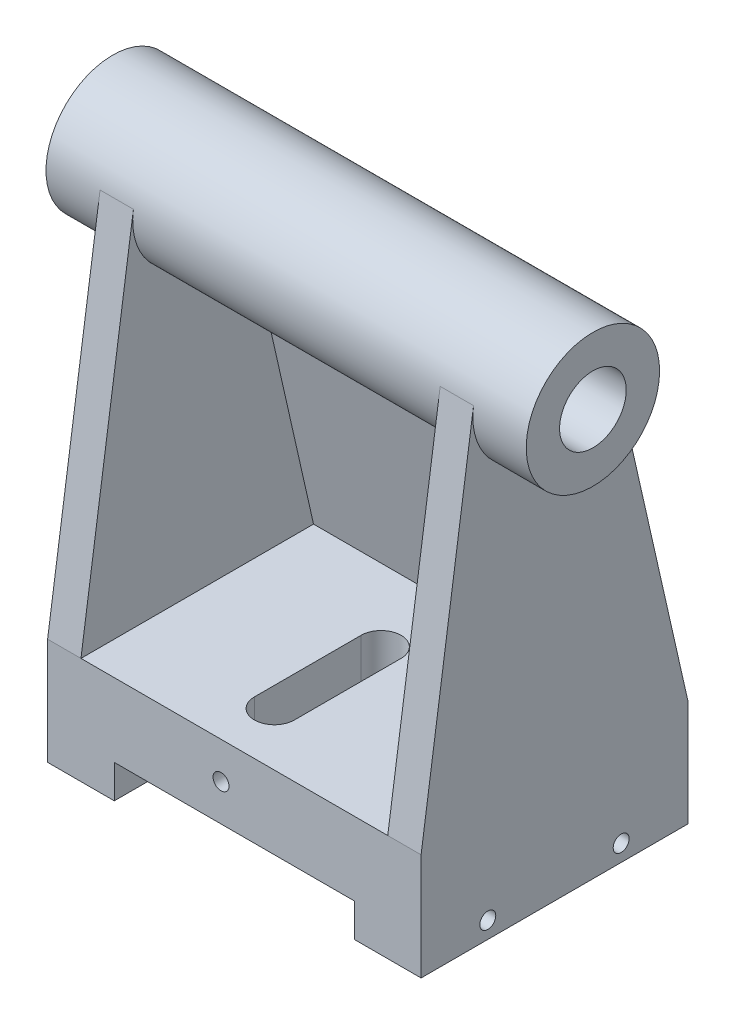
ISO-10303-21;
HEADER;
FILE_DESCRIPTION(('STEP AP214'),'2;1');
FILE_NAME('part.step','',(''),(''),'','','');
FILE_SCHEMA(('AUTOMOTIVE_DESIGN { 1 0 10303 214 1 1 1 1 }'));
ENDSEC;
DATA;
#1=APPLICATION_CONTEXT('core data for automotive mechanical design processes');
#2=APPLICATION_PROTOCOL_DEFINITION('international standard','automotive_design',2000,#1);
#3=PRODUCT_CONTEXT('',#1,'mechanical');
#4=PRODUCT('Part','Part','',(#3));
#5=PRODUCT_RELATED_PRODUCT_CATEGORY('part','',(#4));
#6=PRODUCT_DEFINITION_FORMATION('','',#4);
#7=PRODUCT_DEFINITION_CONTEXT('part definition',#1,'design');
#8=PRODUCT_DEFINITION('design','',#6,#7);
#9=PRODUCT_DEFINITION_SHAPE('','',#8);
#10=(LENGTH_UNIT() NAMED_UNIT(*) SI_UNIT(.MILLI.,.METRE.));
#11=(NAMED_UNIT(*) PLANE_ANGLE_UNIT() SI_UNIT($,.RADIAN.));
#12=(NAMED_UNIT(*) SI_UNIT($,.STERADIAN.) SOLID_ANGLE_UNIT());
#13=UNCERTAINTY_MEASURE_WITH_UNIT(LENGTH_MEASURE(1.E-05),#10,'distance_accuracy_value','');
#14=(GEOMETRIC_REPRESENTATION_CONTEXT(3) GLOBAL_UNCERTAINTY_ASSIGNED_CONTEXT((#13)) GLOBAL_UNIT_ASSIGNED_CONTEXT((#10,
#11,#12)) REPRESENTATION_CONTEXT('',''));
#15=CARTESIAN_POINT('',(0.,0.,0.));
#16=DIRECTION('',(0.,0.,1.));
#17=DIRECTION('',(1.,0.,0.));
#18=AXIS2_PLACEMENT_3D('',#15,#16,#17);
#19=CARTESIAN_POINT('',(0.,5.70278302507328,-25.1954791552857));
#20=DIRECTION('',(0.,0.220757391263944,-0.975328751858745));
#21=DIRECTION('',(0.,0.975328751858745,0.220757391263944));
#22=AXIS2_PLACEMENT_3D('',#19,#20,#21);
#23=PLANE('',#22);
#24=DIRECTION('',(-1.,0.,0.));
#25=VECTOR('',#24,1.);
#26=CARTESIAN_POINT('',(57.15,85.1172926092598,-7.22067842178947));
#27=LINE('',#26,#25);
#28=CARTESIAN_POINT('',(-36.5125,85.1172926092598,-7.22067842178947));
#29=VERTEX_POINT('',#28);
#30=CARTESIAN_POINT('',(36.5125,85.1172926092598,-7.22067842178947));
#31=VERTEX_POINT('',#30);
#32=EDGE_CURVE('E11',#29,#31,#27,.F.);
#33=ORIENTED_EDGE('',*,*,#32,.F.);
#34=DIRECTION('',(0.,0.975328751858745,0.220757391263944));
#35=VECTOR('',#34,1.);
#36=CARTESIAN_POINT('',(-36.5125,98.5262617931576,-4.18567196787884));
#37=LINE('',#36,#35);
#38=CARTESIAN_POINT('',(-36.5125,12.7,-23.6117184360935));
#39=VERTEX_POINT('',#38);
#40=EDGE_CURVE('E45',#39,#29,#37,.T.);
#41=ORIENTED_EDGE('',*,*,#40,.F.);
#42=DIRECTION('',(-1.,0.,0.));
#43=VECTOR('',#42,1.);
#44=CARTESIAN_POINT('',(0.,12.7,-23.6117184360935));
#45=LINE('',#44,#43);
#46=CARTESIAN_POINT('',(36.5125,12.7,-23.6117184360935));
#47=VERTEX_POINT('',#46);
#48=EDGE_CURVE('E59',#47,#39,#45,.T.);
#49=ORIENTED_EDGE('',*,*,#48,.F.);
#50=DIRECTION('',(0.,-0.975328751858745,-0.220757391263944));
#51=VECTOR('',#50,1.);
#52=CARTESIAN_POINT('',(36.5125,10.9477382068425,-24.0083280321212));
#53=LINE('',#52,#51);
#54=EDGE_CURVE('E52',#31,#47,#53,.T.);
#55=ORIENTED_EDGE('',*,*,#54,.F.);
#56=EDGE_LOOP('',(#33,#41,#49,#55));
#57=FACE_BOUND('',#56,.T.);
#58=ADVANCED_FACE('F37',(#57),#23,.F.);
#59=CARTESIAN_POINT('',(0.,12.7,0.));
#60=DIRECTION('',(0.,1.,0.));
#61=DIRECTION('',(0.,0.,1.));
#62=AXIS2_PLACEMENT_3D('',#59,#60,#61);
#63=PLANE('',#62);
#64=CARTESIAN_POINT('',(-3.175,12.7,19.05));
#65=DIRECTION('',(0.,1.,0.));
#66=DIRECTION('',(0.,0.,1.));
#67=AXIS2_PLACEMENT_3D('',#64,#65,#66);
#68=CIRCLE('',#67,4.7625);
#69=CARTESIAN_POINT('',(-7.9375,12.7,19.05));
#70=VERTEX_POINT('',#69);
#71=CARTESIAN_POINT('',(1.5875,12.7,19.05));
#72=VERTEX_POINT('',#71);
#73=EDGE_CURVE('E216',#70,#72,#68,.T.);
#74=ORIENTED_EDGE('',*,*,#73,.F.);
#75=DIRECTION('',(0.,0.,1.));
#76=VECTOR('',#75,1.);
#77=CARTESIAN_POINT('',(-7.9375,12.7,19.05));
#78=LINE('',#77,#76);
#79=CARTESIAN_POINT('',(-7.93749999999999,12.7,-6.34999999999998));
#80=VERTEX_POINT('',#79);
#81=EDGE_CURVE('E227',#80,#70,#78,.T.);
#82=ORIENTED_EDGE('',*,*,#81,.F.);
#83=CARTESIAN_POINT('',(-3.175,12.7,-6.34999999999998));
#84=DIRECTION('',(0.,1.,0.));
#85=DIRECTION('',(0.,0.,1.));
#86=AXIS2_PLACEMENT_3D('',#83,#84,#85);
#87=CIRCLE('',#86,4.76249999999999);
#88=CARTESIAN_POINT('',(1.5875,12.7,-6.34999999999998));
#89=VERTEX_POINT('',#88);
#90=EDGE_CURVE('E224',#89,#80,#87,.T.);
#91=ORIENTED_EDGE('',*,*,#90,.F.);
#92=DIRECTION('',(0.,0.,-1.));
#93=VECTOR('',#92,1.);
#94=CARTESIAN_POINT('',(1.5875,12.7,19.05));
#95=LINE('',#94,#93);
#96=EDGE_CURVE('E221',#72,#89,#95,.T.);
#97=ORIENTED_EDGE('',*,*,#96,.F.);
#98=EDGE_LOOP('',(#74,#82,#91,#97));
#99=FACE_BOUND('',#98,.T.);
#100=DIRECTION('',(0.,0.,-1.));
#101=VECTOR('',#100,1.);
#102=CARTESIAN_POINT('',(36.5125,12.7,31.75));
#103=LINE('',#102,#101);
#104=CARTESIAN_POINT('',(36.5125,12.7,31.75));
#105=VERTEX_POINT('',#104);
#106=EDGE_CURVE('E174',#105,#47,#103,.T.);
#107=ORIENTED_EDGE('',*,*,#106,.T.);
#108=ORIENTED_EDGE('',*,*,#48,.T.);
#109=DIRECTION('',(0.,0.,-1.));
#110=VECTOR('',#109,1.);
#111=CARTESIAN_POINT('',(-36.5125,12.7,31.75));
#112=LINE('',#111,#110);
#113=CARTESIAN_POINT('',(-36.5125,12.7,31.75));
#114=VERTEX_POINT('',#113);
#115=EDGE_CURVE('E186',#114,#39,#112,.T.);
#116=ORIENTED_EDGE('',*,*,#115,.F.);
#117=DIRECTION('',(1.,0.,0.));
#118=VECTOR('',#117,1.);
#119=CARTESIAN_POINT('',(44.45,12.7,31.75));
#120=LINE('',#119,#118);
#121=EDGE_CURVE('E284',#114,#105,#120,.T.);
#122=ORIENTED_EDGE('',*,*,#121,.T.);
#123=EDGE_LOOP('',(#107,#108,#116,#122));
#124=FACE_BOUND('',#123,.T.);
#125=ADVANCED_FACE('F347',(#99,#124),#63,.T.);
#126=CARTESIAN_POINT('',(36.5125,96.774,3.556));
#127=DIRECTION('',(-1.,0.,0.));
#128=DIRECTION('',(0.,0.,1.));
#129=AXIS2_PLACEMENT_3D('',#126,#127,#128);
#130=PLANE('',#129);
#131=CARTESIAN_POINT('',(36.5125,96.774,3.556));
#132=DIRECTION('',(-1.,0.,0.));
#133=DIRECTION('',(0.,0.,1.));
#134=AXIS2_PLACEMENT_3D('',#131,#132,#133);
#135=CIRCLE('',#134,15.875);
#136=CARTESIAN_POINT('',(36.5125,99.0453243279636,19.2676743473508));
#137=VERTEX_POINT('',#136);
#138=EDGE_CURVE('E167',#31,#137,#135,.T.);
#139=ORIENTED_EDGE('',*,*,#138,.F.);
#140=ORIENTED_EDGE('',*,*,#54,.T.);
#141=ORIENTED_EDGE('',*,*,#106,.F.);
#142=DIRECTION('',(0.,-0.989711769911861,0.143075548218177));
#143=VECTOR('',#142,1.);
#144=CARTESIAN_POINT('',(36.5125,12.7,31.75));
#145=LINE('',#144,#143);
#146=EDGE_CURVE('E170',#137,#105,#145,.T.);
#147=ORIENTED_EDGE('',*,*,#146,.F.);
#148=EDGE_LOOP('',(#139,#140,#141,#147));
#149=FACE_BOUND('',#148,.T.);
#150=ADVANCED_FACE('F168',(#149),#130,.T.);
#151=CARTESIAN_POINT('',(-36.5125,96.774,3.556));
#152=DIRECTION('',(1.,0.,0.));
#153=DIRECTION('',(0.,0.,-1.));
#154=AXIS2_PLACEMENT_3D('',#151,#152,#153);
#155=PLANE('',#154);
#156=ORIENTED_EDGE('',*,*,#115,.T.);
#157=ORIENTED_EDGE('',*,*,#40,.T.);
#158=CARTESIAN_POINT('',(-36.5125,96.774,3.556));
#159=DIRECTION('',(1.,0.,0.));
#160=DIRECTION('',(0.,0.,-1.));
#161=AXIS2_PLACEMENT_3D('',#158,#159,#160);
#162=CIRCLE('',#161,15.875);
#163=CARTESIAN_POINT('',(-36.5125,99.0453243279636,19.2676743473508));
#164=VERTEX_POINT('',#163);
#165=EDGE_CURVE('E181',#164,#29,#162,.T.);
#166=ORIENTED_EDGE('',*,*,#165,.F.);
#167=DIRECTION('',(0.,-0.989711769911861,0.143075548218177));
#168=VECTOR('',#167,1.);
#169=CARTESIAN_POINT('',(-36.5125,12.7,31.75));
#170=LINE('',#169,#168);
#171=EDGE_CURVE('E189',#164,#114,#170,.T.);
#172=ORIENTED_EDGE('',*,*,#171,.T.);
#173=EDGE_LOOP('',(#156,#157,#166,#172));
#174=FACE_BOUND('',#173,.T.);
#175=ADVANCED_FACE('F357',(#174),#155,.T.);
#176=CARTESIAN_POINT('',(-3.175,3.96875,31.75));
#177=DIRECTION('',(0.,0.,1.));
#178=DIRECTION('',(1.,0.,0.));
#179=AXIS2_PLACEMENT_3D('',#176,#177,#178);
#180=CYLINDRICAL_SURFACE('',#179,1.89864999999999);
#181=CARTESIAN_POINT('',(-1.27635000000001,3.96875,23.4176692213926));
#182=CARTESIAN_POINT('',(-1.27636109537331,3.86700854889232,23.4176794163693));
#183=CARTESIAN_POINT('',(-1.28457643204734,3.76512142960715,23.4212743372267));
#184=CARTESIAN_POINT('',(-1.31713207621968,3.56426805016252,23.4352053083698));
#185=CARTESIAN_POINT('',(-1.34151375473095,3.4653099661598,23.4455586529676));
#186=CARTESIAN_POINT('',(-1.40532467651031,3.27355991178216,23.4716320443976));
#187=CARTESIAN_POINT('',(-1.44469746407244,3.18074632249306,23.4873319332927));
#188=CARTESIAN_POINT('',(-1.53720817607736,3.00306394743353,23.5223013586832));
#189=CARTESIAN_POINT('',(-1.59034302696615,2.9181933934575,23.5415700978551));
#190=CARTESIAN_POINT('',(-1.71209910404013,2.75393589327512,23.5827318460628));
#191=CARTESIAN_POINT('',(-1.78137703205274,2.67505656503448,23.6047089046179));
#192=CARTESIAN_POINT('',(-1.93207009057371,2.52966532147243,23.6481165564904));
#193=CARTESIAN_POINT('',(-2.01348943011268,2.46315771306291,23.6695469572703));
#194=CARTESIAN_POINT('',(-2.19006994773536,2.34188378240749,23.7104545896829));
#195=CARTESIAN_POINT('',(-2.28564415517688,2.28767867738791,23.7298225918301));
#196=CARTESIAN_POINT('',(-2.48546477666903,2.19633174027643,23.7634051821786));
#197=CARTESIAN_POINT('',(-2.5897076638692,2.15918300853089,23.7776218537076));
#198=CARTESIAN_POINT('',(-2.79858456681381,2.10481269799039,23.7987049677712));
#199=CARTESIAN_POINT('',(-2.90295831724876,2.08671813989772,23.8058922221296));
#200=CARTESIAN_POINT('',(-3.1134916220198,2.06815953503027,23.8132657957007));
#201=CARTESIAN_POINT('',(-3.21965050031917,2.06768895798279,23.8134547080323));
#202=CARTESIAN_POINT('',(-3.42443326804291,2.08391144350377,23.8070060155598));
#203=CARTESIAN_POINT('',(-3.52314705898785,2.09964819920741,23.8007487585062));
#204=CARTESIAN_POINT('',(-3.71639796172513,2.14621301204534,23.7826227230789));
#205=CARTESIAN_POINT('',(-3.8109347666598,2.17704217592371,23.7707535331777));
#206=CARTESIAN_POINT('',(-3.99484859828555,2.25329594874747,23.7423395811026));
#207=CARTESIAN_POINT('',(-4.08412655183177,2.298933245921,23.7257271369143));
#208=CARTESIAN_POINT('',(-4.25398702067136,2.40330915718809,23.6894770707807));
#209=CARTESIAN_POINT('',(-4.33456655014057,2.4620522488957,23.669838415637));
#210=CARTESIAN_POINT('',(-4.49032614462156,2.59544163092466,23.6280177191903));
#211=CARTESIAN_POINT('',(-4.56481050410694,2.67087566716468,23.6057533351387));
#212=CARTESIAN_POINT('',(-4.70035563127269,2.83325348241173,23.5621809066277));
#213=CARTESIAN_POINT('',(-4.76141206436108,2.92020096353975,23.5408731727402));
#214=CARTESIAN_POINT('',(-4.86994479180545,3.10622790762721,23.5010687480331));
#215=CARTESIAN_POINT('',(-4.91699471381561,3.20557815474876,23.4826670619403));
#216=CARTESIAN_POINT('',(-4.9934204103413,3.41172055153924,23.4518713592928));
#217=CARTESIAN_POINT('',(-5.02280757346598,3.51850785625665,23.4394734726074));
#218=CARTESIAN_POINT('',(-5.06138720629323,3.72955634664625,23.4230270618592));
#219=CARTESIAN_POINT('',(-5.07169859499818,3.8335765451844,23.4185168442205));
#220=CARTESIAN_POINT('',(-5.07509542813421,4.04193603263268,23.4170415319272));
#221=CARTESIAN_POINT('',(-5.06818604211773,4.14627521639412,23.4200741729602));
#222=CARTESIAN_POINT('',(-5.03835600957465,4.34612314328988,23.432869307112));
#223=CARTESIAN_POINT('',(-5.01636065421577,4.44179797588751,23.4422424729454));
#224=CARTESIAN_POINT('',(-4.95818144187578,4.6280367298851,23.4661807458619));
#225=CARTESIAN_POINT('',(-4.92199445198079,4.71859951770804,23.4807469992951));
#226=CARTESIAN_POINT('',(-4.83482629725628,4.8961229564048,23.5141504173575));
#227=CARTESIAN_POINT('',(-4.7833065099966,4.98279026732356,23.5331363525304));
#228=CARTESIAN_POINT('',(-4.66748704685098,5.14664189723617,23.5730117871511));
#229=CARTESIAN_POINT('',(-4.60318219361281,5.22382235394204,23.5939020559027));
#230=CARTESIAN_POINT('',(-4.45805397108877,5.37238766651749,23.6370809459295));
#231=CARTESIAN_POINT('',(-4.3763654304089,5.44293334339339,23.6593598565107));
#232=CARTESIAN_POINT('',(-4.20177670214906,5.56944387806319,23.7013640696405));
#233=CARTESIAN_POINT('',(-4.10887608433279,5.62540817607153,23.7210892741365));
#234=CARTESIAN_POINT('',(-3.91419605730316,5.72095041692597,23.7558214443055));
#235=CARTESIAN_POINT('',(-3.81242057288327,5.76053555918837,23.770830482258));
#236=CARTESIAN_POINT('',(-3.60290989529843,5.82176324182445,23.7944057020004));
#237=CARTESIAN_POINT('',(-3.49517794592671,5.84341544748845,23.8029753541858));
#238=CARTESIAN_POINT('',(-3.28434953817162,5.86702018035335,23.8123375572745));
#239=CARTESIAN_POINT('',(-3.18140573159004,5.8701595241815,23.8135985519662));
#240=CARTESIAN_POINT('',(-2.97650888929617,5.85977907101578,23.8094644116412));
#241=CARTESIAN_POINT('',(-2.87455570763452,5.84626176674785,23.8040702725886));
#242=CARTESIAN_POINT('',(-2.67770547398715,5.8037992397424,23.7874652274517));
#243=CARTESIAN_POINT('',(-2.58268817424706,5.77533481016413,23.7764358685165));
#244=CARTESIAN_POINT('',(-2.39879388618913,5.70428968526639,23.7497395835493));
#245=CARTESIAN_POINT('',(-2.3099180377241,5.66170637794273,23.7340717994622));
#246=CARTESIAN_POINT('',(-2.13652279765407,5.56151555532535,23.6987789164136));
#247=CARTESIAN_POINT('',(-2.05236832553304,5.50332833224135,23.6790097806346));
#248=CARTESIAN_POINT('',(-1.8946654941439,5.37445070759384,23.6378974308896));
#249=CARTESIAN_POINT('',(-1.82112150558812,5.30375518010467,23.6165535736985));
#250=CARTESIAN_POINT('',(-1.68205700493963,5.14673777584433,23.5730697242086));
#251=CARTESIAN_POINT('',(-1.61730648303211,5.05972292355135,23.550961324422));
#252=CARTESIAN_POINT('',(-1.50327232163552,4.87535712002378,23.5098680876822));
#253=CARTESIAN_POINT('',(-1.45399054238121,4.77800492752739,23.4908836265372));
#254=CARTESIAN_POINT('',(-1.37624575725972,4.58457193643154,23.4599300754621));
#255=CARTESIAN_POINT('',(-1.34631522252147,4.48915582888302,23.4474854791932));
#256=CARTESIAN_POINT('',(-1.30183535519326,4.29439287335857,23.4287287231322));
#257=CARTESIAN_POINT('',(-1.28724306895465,4.19505781501907,23.4223994418888));
#258=CARTESIAN_POINT('',(-1.27775265373172,4.05313697538481,23.41827765461));
#259=CARTESIAN_POINT('',(-1.27634539723918,4.01095602163411,23.4176649921487));
#260=CARTESIAN_POINT('',(-1.27635000000001,3.96875,23.4176692213926));
#261=B_SPLINE_CURVE_WITH_KNOTS('',3,(#181,#182,#183,#184,#185,#186,#187,#188,#189,#190,#191,
#192,#193,#194,#195,#196,#197,#198,#199,#200,#201,#202,#203,#204,#205,#206,#207,#208,#209,#210,
#211,#212,#213,#214,#215,#216,#217,#218,#219,#220,#221,#222,#223,#224,#225,#226,#227,#228,#229,
#230,#231,#232,#233,#234,#235,#236,#237,#238,#239,#240,#241,#242,#243,#244,#245,#246,#247,#248,
#249,#250,#251,#252,#253,#254,#255,#256,#257,#258,#259,#260),.UNSPECIFIED.,.T.,.F.,(4,2,2,2,2,2,
2,2,2,2,2,2,2,2,2,2,2,2,2,2,2,2,2,2,2,2,2,2,2,2,2,2,2,2,2,2,2,2,2,4),(0.,0.305093849963127,
0.610971489482485,0.915708424940184,1.22037736049338,1.54073919281254,1.86121234340842,
2.19422460825775,2.52710204385604,2.8439593028596,3.16069915452012,3.45976416385431,
3.75885110726392,4.06243952061921,4.36613181467219,4.68964610005574,5.01326466444632,
5.34591141592363,5.67834345239776,5.99056931291456,6.30270145676864,6.59722418736115,
6.89181197277319,7.1983011225899,7.50491463986562,7.83399718143667,8.16309235477075,
8.49204272109746,8.82081567790816,9.12826087027417,9.43566005797376,9.73372769877998,
10.0318505131461,10.3431193970311,10.6545161361645,10.9850342935787,11.3155921831175,
11.6165924637609,11.9167475508271,12.0433114782312),.UNSPECIFIED.);
#262=CARTESIAN_POINT('',(-1.27635000000001,3.96875,23.4176692213926));
#263=VERTEX_POINT('',#262);
#264=EDGE_CURVE('E243',#263,#263,#261,.T.);
#265=ORIENTED_EDGE('',*,*,#264,.T.);
#266=EDGE_LOOP('',(#265));
#267=FACE_BOUND('',#266,.T.);
#268=CARTESIAN_POINT('',(-3.175,3.96875,31.75));
#269=DIRECTION('',(0.,0.,1.));
#270=DIRECTION('',(1.,0.,0.));
#271=AXIS2_PLACEMENT_3D('',#268,#269,#270);
#272=CIRCLE('',#271,1.89864999999999);
#273=CARTESIAN_POINT('',(-1.27635000000001,3.96875,31.75));
#274=VERTEX_POINT('',#273);
#275=EDGE_CURVE('E247',#274,#274,#272,.T.);
#276=ORIENTED_EDGE('',*,*,#275,.T.);
#277=EDGE_LOOP('',(#276));
#278=FACE_BOUND('',#277,.T.);
#279=ADVANCED_FACE('F360',(#267,#278),#180,.F.);
#280=CARTESIAN_POINT('',(0.,-12.7,0.));
#281=DIRECTION('',(0.,1.,0.));
#282=DIRECTION('',(0.,0.,1.));
#283=AXIS2_PLACEMENT_3D('',#280,#281,#282);
#284=PLANE('',#283);
#285=DIRECTION('',(-1.,0.,0.));
#286=VECTOR('',#285,1.);
#287=CARTESIAN_POINT('',(44.45,-12.7,-31.75));
#288=LINE('',#287,#286);
#289=CARTESIAN_POINT('',(-28.575,-12.7,-31.75));
#290=VERTEX_POINT('',#289);
#291=CARTESIAN_POINT('',(-44.45,-12.7,-31.75));
#292=VERTEX_POINT('',#291);
#293=EDGE_CURVE('E295',#290,#292,#288,.T.);
#294=ORIENTED_EDGE('',*,*,#293,.F.);
#295=DIRECTION('',(0.,0.,1.));
#296=VECTOR('',#295,1.);
#297=CARTESIAN_POINT('',(-28.575,-12.7,-31.75));
#298=LINE('',#297,#296);
#299=CARTESIAN_POINT('',(-28.575,-12.7,31.75));
#300=VERTEX_POINT('',#299);
#301=EDGE_CURVE('E264',#290,#300,#298,.T.);
#302=ORIENTED_EDGE('',*,*,#301,.T.);
#303=DIRECTION('',(1.,0.,0.));
#304=VECTOR('',#303,1.);
#305=CARTESIAN_POINT('',(44.45,-12.7,31.75));
#306=LINE('',#305,#304);
#307=CARTESIAN_POINT('',(-44.45,-12.7,31.75));
#308=VERTEX_POINT('',#307);
#309=EDGE_CURVE('E290',#308,#300,#306,.T.);
#310=ORIENTED_EDGE('',*,*,#309,.F.);
#311=DIRECTION('',(0.,0.,1.));
#312=VECTOR('',#311,1.);
#313=CARTESIAN_POINT('',(-44.45,-12.7,31.75));
#314=LINE('',#313,#312);
#315=EDGE_CURVE('E273',#292,#308,#314,.T.);
#316=ORIENTED_EDGE('',*,*,#315,.F.);
#317=EDGE_LOOP('',(#294,#302,#310,#316));
#318=FACE_BOUND('',#317,.T.);
#319=ADVANCED_FACE('F418',(#318),#284,.F.);
#320=CARTESIAN_POINT('',(-44.45,12.7,31.75));
#321=DIRECTION('',(1.,0.,0.));
#322=DIRECTION('',(0.,0.,-1.));
#323=AXIS2_PLACEMENT_3D('',#320,#321,#322);
#324=PLANE('',#323);
#325=ORIENTED_EDGE('',*,*,#315,.T.);
#326=DIRECTION('',(0.,-1.,0.));
#327=VECTOR('',#326,1.);
#328=CARTESIAN_POINT('',(-44.45,12.7,31.75));
#329=LINE('',#328,#327);
#330=CARTESIAN_POINT('',(-44.45,12.7,31.75));
#331=VERTEX_POINT('',#330);
#332=EDGE_CURVE('E307',#331,#308,#329,.T.);
#333=ORIENTED_EDGE('',*,*,#332,.F.);
#334=DIRECTION('',(0.,-0.989711769911861,0.143075548218177));
#335=VECTOR('',#334,1.);
#336=CARTESIAN_POINT('',(-44.45,12.7,31.75));
#337=LINE('',#336,#335);
#338=CARTESIAN_POINT('',(-44.45,99.0453243279636,19.2676743473508));
#339=VERTEX_POINT('',#338);
#340=EDGE_CURVE('E187',#339,#331,#337,.T.);
#341=ORIENTED_EDGE('',*,*,#340,.F.);
#342=CARTESIAN_POINT('',(-44.45,96.774,3.556));
#343=DIRECTION('',(1.,0.,0.));
#344=DIRECTION('',(0.,0.,-1.));
#345=AXIS2_PLACEMENT_3D('',#342,#343,#344);
#346=CIRCLE('',#345,15.875);
#347=CARTESIAN_POINT('',(-44.45,100.278523586315,-11.9273439357576));
#348=VERTEX_POINT('',#347);
#349=EDGE_CURVE('E197',#339,#348,#346,.T.);
#350=ORIENTED_EDGE('',*,*,#349,.T.);
#351=DIRECTION('',(0.,0.975328751858745,0.220757391263944));
#352=VECTOR('',#351,1.);
#353=CARTESIAN_POINT('',(-44.45,26.372250461201,-28.6554020618485));
#354=LINE('',#353,#352);
#355=CARTESIAN_POINT('',(-44.45,12.7,-31.75));
#356=VERTEX_POINT('',#355);
#357=EDGE_CURVE('E192',#356,#348,#354,.T.);
#358=ORIENTED_EDGE('',*,*,#357,.F.);
#359=DIRECTION('',(0.,-1.,0.));
#360=VECTOR('',#359,1.);
#361=CARTESIAN_POINT('',(-44.45,12.7,-31.75));
#362=LINE('',#361,#360);
#363=EDGE_CURVE('E286',#356,#292,#362,.T.);
#364=ORIENTED_EDGE('',*,*,#363,.T.);
#365=EDGE_LOOP('',(#325,#333,#341,#350,#358,#364));
#366=FACE_BOUND('',#365,.T.);
#367=ADVANCED_FACE('F39',(#366),#324,.F.);
#368=CARTESIAN_POINT('',(44.45,12.7,31.75));
#369=DIRECTION('',(0.,0.,-1.));
#370=DIRECTION('',(-1.,0.,0.));
#371=AXIS2_PLACEMENT_3D('',#368,#369,#370);
#372=PLANE('',#371);
#373=ORIENTED_EDGE('',*,*,#275,.F.);
#374=EDGE_LOOP('',(#373));
#375=FACE_BOUND('',#374,.T.);
#376=ORIENTED_EDGE('',*,*,#309,.T.);
#377=DIRECTION('',(0.,-1.,0.));
#378=VECTOR('',#377,1.);
#379=CARTESIAN_POINT('',(-28.575,-12.7,31.75));
#380=LINE('',#379,#378);
#381=CARTESIAN_POINT('',(-28.575,-4.7625,31.75));
#382=VERTEX_POINT('',#381);
#383=EDGE_CURVE('E253',#382,#300,#380,.T.);
#384=ORIENTED_EDGE('',*,*,#383,.F.);
#385=DIRECTION('',(-1.,0.,0.));
#386=VECTOR('',#385,1.);
#387=CARTESIAN_POINT('',(28.575,-4.76249999999999,31.75));
#388=LINE('',#387,#386);
#389=CARTESIAN_POINT('',(28.575,-4.76249999999999,31.75));
#390=VERTEX_POINT('',#389);
#391=EDGE_CURVE('E258',#390,#382,#388,.T.);
#392=ORIENTED_EDGE('',*,*,#391,.F.);
#393=DIRECTION('',(0.,1.,0.));
#394=VECTOR('',#393,1.);
#395=CARTESIAN_POINT('',(28.575,-12.7,31.75));
#396=LINE('',#395,#394);
#397=CARTESIAN_POINT('',(28.575,-12.7,31.75));
#398=VERTEX_POINT('',#397);
#399=EDGE_CURVE('E266',#398,#390,#396,.T.);
#400=ORIENTED_EDGE('',*,*,#399,.F.);
#401=CARTESIAN_POINT('',(44.45,-12.7,31.75));
#402=VERTEX_POINT('',#401);
#403=EDGE_CURVE('E289',#398,#402,#306,.T.);
#404=ORIENTED_EDGE('',*,*,#403,.T.);
#405=DIRECTION('',(0.,-1.,0.));
#406=VECTOR('',#405,1.);
#407=CARTESIAN_POINT('',(44.45,12.7,31.75));
#408=LINE('',#407,#406);
#409=CARTESIAN_POINT('',(44.45,12.7,31.75));
#410=VERTEX_POINT('',#409);
#411=EDGE_CURVE('E304',#410,#402,#408,.T.);
#412=ORIENTED_EDGE('',*,*,#411,.F.);
#413=DIRECTION('',(1.,0.,0.));
#414=VECTOR('',#413,1.);
#415=CARTESIAN_POINT('',(36.5125,12.7,31.75));
#416=LINE('',#415,#414);
#417=EDGE_CURVE('E173',#105,#410,#416,.T.);
#418=ORIENTED_EDGE('',*,*,#417,.F.);
#419=ORIENTED_EDGE('',*,*,#121,.F.);
#420=EDGE_CURVE('E280',#331,#114,#120,.T.);
#421=ORIENTED_EDGE('',*,*,#420,.F.);
#422=ORIENTED_EDGE('',*,*,#332,.T.);
#423=EDGE_LOOP('',(#376,#384,#392,#400,#404,#412,#418,#419,#421,#422));
#424=FACE_BOUND('',#423,.T.);
#425=ADVANCED_FACE('F430',(#375,#424),#372,.F.);
#426=CARTESIAN_POINT('',(44.45,12.7,31.75));
#427=DIRECTION('',(-1.,0.,0.));
#428=DIRECTION('',(0.,0.,1.));
#429=AXIS2_PLACEMENT_3D('',#426,#427,#428);
#430=PLANE('',#429);
#431=CARTESIAN_POINT('',(44.45,-8.73125,15.875));
#432=DIRECTION('',(1.,0.,0.));
#433=DIRECTION('',(0.,0.,-1.));
#434=AXIS2_PLACEMENT_3D('',#431,#432,#433);
#435=CIRCLE('',#434,1.89864999999999);
#436=CARTESIAN_POINT('',(44.45,-8.73125,13.97635));
#437=VERTEX_POINT('',#436);
#438=EDGE_CURVE('E466',#437,#437,#435,.T.);
#439=ORIENTED_EDGE('',*,*,#438,.F.);
#440=EDGE_LOOP('',(#439));
#441=FACE_BOUND('',#440,.T.);
#442=CARTESIAN_POINT('',(44.45,-8.73125,-15.875));
#443=DIRECTION('',(1.,0.,0.));
#444=DIRECTION('',(0.,0.,-1.));
#445=AXIS2_PLACEMENT_3D('',#442,#443,#444);
#446=CIRCLE('',#445,1.89864999999999);
#447=CARTESIAN_POINT('',(44.45,-8.73125,-17.77365));
#448=VERTEX_POINT('',#447);
#449=EDGE_CURVE('E469',#448,#448,#446,.T.);
#450=ORIENTED_EDGE('',*,*,#449,.F.);
#451=EDGE_LOOP('',(#450));
#452=FACE_BOUND('',#451,.T.);
#453=DIRECTION('',(0.,0.,-1.));
#454=VECTOR('',#453,1.);
#455=CARTESIAN_POINT('',(44.45,-12.7,31.75));
#456=LINE('',#455,#454);
#457=CARTESIAN_POINT('',(44.45,-12.7,-31.75));
#458=VERTEX_POINT('',#457);
#459=EDGE_CURVE('E293',#402,#458,#456,.T.);
#460=ORIENTED_EDGE('',*,*,#459,.T.);
#461=DIRECTION('',(0.,-1.,0.));
#462=VECTOR('',#461,1.);
#463=CARTESIAN_POINT('',(44.45,12.7,-31.75));
#464=LINE('',#463,#462);
#465=CARTESIAN_POINT('',(44.45,12.7,-31.75));
#466=VERTEX_POINT('',#465);
#467=EDGE_CURVE('E301',#466,#458,#464,.T.);
#468=ORIENTED_EDGE('',*,*,#467,.F.);
#469=DIRECTION('',(0.,0.975328751858745,0.220757391263944));
#470=VECTOR('',#469,1.);
#471=CARTESIAN_POINT('',(44.45,26.372250461201,-28.6554020618485));
#472=LINE('',#471,#470);
#473=CARTESIAN_POINT('',(44.45,100.278523586315,-11.9273439357576));
#474=VERTEX_POINT('',#473);
#475=EDGE_CURVE('E209',#466,#474,#472,.T.);
#476=ORIENTED_EDGE('',*,*,#475,.T.);
#477=CARTESIAN_POINT('',(44.45,96.774,3.556));
#478=DIRECTION('',(-1.,0.,0.));
#479=DIRECTION('',(0.,0.,1.));
#480=AXIS2_PLACEMENT_3D('',#477,#478,#479);
#481=CIRCLE('',#480,15.875);
#482=CARTESIAN_POINT('',(44.45,99.0453243279636,19.2676743473508));
#483=VERTEX_POINT('',#482);
#484=EDGE_CURVE('E205',#474,#483,#481,.T.);
#485=ORIENTED_EDGE('',*,*,#484,.T.);
#486=DIRECTION('',(0.,-0.989711769911861,0.143075548218177));
#487=VECTOR('',#486,1.);
#488=CARTESIAN_POINT('',(44.45,12.7,31.75));
#489=LINE('',#488,#487);
#490=EDGE_CURVE('E203',#483,#410,#489,.T.);
#491=ORIENTED_EDGE('',*,*,#490,.T.);
#492=ORIENTED_EDGE('',*,*,#411,.T.);
#493=EDGE_LOOP('',(#460,#468,#476,#485,#491,#492));
#494=FACE_BOUND('',#493,.T.);
#495=ADVANCED_FACE('F379',(#441,#452,#494),#430,.F.);
#496=CARTESIAN_POINT('',(44.45,12.7,-31.75));
#497=DIRECTION('',(0.,0.,1.));
#498=DIRECTION('',(1.,0.,0.));
#499=AXIS2_PLACEMENT_3D('',#496,#497,#498);
#500=PLANE('',#499);
#501=CARTESIAN_POINT('',(-3.175,3.96875,-31.75));
#502=DIRECTION('',(0.,0.,1.));
#503=DIRECTION('',(1.,0.,0.));
#504=AXIS2_PLACEMENT_3D('',#501,#502,#503);
#505=CIRCLE('',#504,1.89864999999999);
#506=CARTESIAN_POINT('',(-1.27635000000001,3.96875,-31.75));
#507=VERTEX_POINT('',#506);
#508=EDGE_CURVE('E250',#507,#507,#505,.T.);
#509=ORIENTED_EDGE('',*,*,#508,.T.);
#510=EDGE_LOOP('',(#509));
#511=FACE_BOUND('',#510,.T.);
#512=DIRECTION('',(-1.,0.,0.));
#513=VECTOR('',#512,1.);
#514=CARTESIAN_POINT('',(28.575,-4.76249999999999,-31.75));
#515=LINE('',#514,#513);
#516=CARTESIAN_POINT('',(28.575,-4.76249999999999,-31.75));
#517=VERTEX_POINT('',#516);
#518=CARTESIAN_POINT('',(-28.575,-4.7625,-31.75));
#519=VERTEX_POINT('',#518);
#520=EDGE_CURVE('E261',#517,#519,#515,.T.);
#521=ORIENTED_EDGE('',*,*,#520,.T.);
#522=DIRECTION('',(0.,-1.,0.));
#523=VECTOR('',#522,1.);
#524=CARTESIAN_POINT('',(-28.575,-12.7,-31.75));
#525=LINE('',#524,#523);
#526=EDGE_CURVE('E254',#519,#290,#525,.T.);
#527=ORIENTED_EDGE('',*,*,#526,.T.);
#528=ORIENTED_EDGE('',*,*,#293,.T.);
#529=ORIENTED_EDGE('',*,*,#363,.F.);
#530=DIRECTION('',(-1.,0.,0.));
#531=VECTOR('',#530,1.);
#532=CARTESIAN_POINT('',(44.45,12.7,-31.75));
#533=LINE('',#532,#531);
#534=EDGE_CURVE('E283',#466,#356,#533,.T.);
#535=ORIENTED_EDGE('',*,*,#534,.F.);
#536=ORIENTED_EDGE('',*,*,#467,.T.);
#537=CARTESIAN_POINT('',(28.575,-12.7,-31.75));
#538=VERTEX_POINT('',#537);
#539=EDGE_CURVE('E296',#458,#538,#288,.T.);
#540=ORIENTED_EDGE('',*,*,#539,.T.);
#541=DIRECTION('',(0.,1.,0.));
#542=VECTOR('',#541,1.);
#543=CARTESIAN_POINT('',(28.575,-12.7,-31.75));
#544=LINE('',#543,#542);
#545=EDGE_CURVE('E257',#538,#517,#544,.T.);
#546=ORIENTED_EDGE('',*,*,#545,.T.);
#547=EDGE_LOOP('',(#521,#527,#528,#529,#535,#536,#540,#546));
#548=FACE_BOUND('',#547,.T.);
#549=ADVANCED_FACE('F441',(#511,#548),#500,.F.);
#550=ORIENTED_EDGE('',*,*,#403,.F.);
#551=DIRECTION('',(0.,0.,1.));
#552=VECTOR('',#551,1.);
#553=CARTESIAN_POINT('',(28.575,-12.7,-31.75));
#554=LINE('',#553,#552);
#555=EDGE_CURVE('E276',#538,#398,#554,.T.);
#556=ORIENTED_EDGE('',*,*,#555,.F.);
#557=ORIENTED_EDGE('',*,*,#539,.F.);
#558=ORIENTED_EDGE('',*,*,#459,.F.);
#559=EDGE_LOOP('',(#550,#556,#557,#558));
#560=FACE_BOUND('',#559,.T.);
#561=ADVANCED_FACE('F425',(#560),#284,.F.);
#562=CARTESIAN_POINT('',(-28.575,-12.7,-31.75));
#563=DIRECTION('',(-1.,0.,0.));
#564=DIRECTION('',(0.,0.,1.));
#565=AXIS2_PLACEMENT_3D('',#562,#563,#564);
#566=PLANE('',#565);
#567=ORIENTED_EDGE('',*,*,#383,.T.);
#568=ORIENTED_EDGE('',*,*,#301,.F.);
#569=ORIENTED_EDGE('',*,*,#526,.F.);
#570=DIRECTION('',(0.,0.,1.));
#571=VECTOR('',#570,1.);
#572=CARTESIAN_POINT('',(-28.575,-4.7625,-31.75));
#573=LINE('',#572,#571);
#574=EDGE_CURVE('E271',#519,#382,#573,.T.);
#575=ORIENTED_EDGE('',*,*,#574,.T.);
#576=EDGE_LOOP('',(#567,#568,#569,#575));
#577=FACE_BOUND('',#576,.T.);
#578=ADVANCED_FACE('F439',(#577),#566,.F.);
#579=CARTESIAN_POINT('',(28.575,-4.76249999999999,-31.75));
#580=DIRECTION('',(0.,1.,0.));
#581=DIRECTION('',(-1.,0.,0.));
#582=AXIS2_PLACEMENT_3D('',#579,#580,#581);
#583=PLANE('',#582);
#584=DIRECTION('',(0.,0.,1.));
#585=VECTOR('',#584,1.);
#586=CARTESIAN_POINT('',(-7.93749999999999,-4.76249999999999,-31.75));
#587=LINE('',#586,#585);
#588=CARTESIAN_POINT('',(-7.93749999999999,-4.76249999999999,-6.34999999999998));
#589=VERTEX_POINT('',#588);
#590=CARTESIAN_POINT('',(-7.9375,-4.76249999999999,19.05));
#591=VERTEX_POINT('',#590);
#592=EDGE_CURVE('E388',#589,#591,#587,.T.);
#593=ORIENTED_EDGE('',*,*,#592,.T.);
#594=CARTESIAN_POINT('',(-3.175,-4.76249999999999,19.05));
#595=DIRECTION('',(0.,1.,0.));
#596=DIRECTION('',(-1.,0.,0.));
#597=AXIS2_PLACEMENT_3D('',#594,#595,#596);
#598=CIRCLE('',#597,4.7625);
#599=CARTESIAN_POINT('',(1.5875,-4.76249999999999,19.05));
#600=VERTEX_POINT('',#599);
#601=EDGE_CURVE('E244',#591,#600,#598,.T.);
#602=ORIENTED_EDGE('',*,*,#601,.T.);
#603=DIRECTION('',(0.,0.,-1.));
#604=VECTOR('',#603,1.);
#605=CARTESIAN_POINT('',(1.58749999999999,-4.76249999999999,-31.75));
#606=LINE('',#605,#604);
#607=CARTESIAN_POINT('',(1.58749999999999,-4.76249999999999,-6.34999999999998));
#608=VERTEX_POINT('',#607);
#609=EDGE_CURVE('E310',#600,#608,#606,.T.);
#610=ORIENTED_EDGE('',*,*,#609,.T.);
#611=CARTESIAN_POINT('',(-3.175,-4.76249999999999,-6.34999999999998));
#612=DIRECTION('',(0.,1.,0.));
#613=DIRECTION('',(-1.,0.,0.));
#614=AXIS2_PLACEMENT_3D('',#611,#612,#613);
#615=CIRCLE('',#614,4.76249999999999);
#616=EDGE_CURVE('E240',#608,#589,#615,.T.);
#617=ORIENTED_EDGE('',*,*,#616,.T.);
#618=EDGE_LOOP('',(#593,#602,#610,#617));
#619=FACE_BOUND('',#618,.T.);
#620=ORIENTED_EDGE('',*,*,#391,.T.);
#621=ORIENTED_EDGE('',*,*,#574,.F.);
#622=ORIENTED_EDGE('',*,*,#520,.F.);
#623=DIRECTION('',(0.,0.,1.));
#624=VECTOR('',#623,1.);
#625=CARTESIAN_POINT('',(28.575,-4.76249999999999,-31.75));
#626=LINE('',#625,#624);
#627=EDGE_CURVE('E274',#517,#390,#626,.T.);
#628=ORIENTED_EDGE('',*,*,#627,.T.);
#629=EDGE_LOOP('',(#620,#621,#622,#628));
#630=FACE_BOUND('',#629,.T.);
#631=ADVANCED_FACE('F393',(#619,#630),#583,.F.);
#632=CARTESIAN_POINT('',(28.575,-12.7,-31.75));
#633=DIRECTION('',(1.,0.,0.));
#634=DIRECTION('',(0.,0.,-1.));
#635=AXIS2_PLACEMENT_3D('',#632,#633,#634);
#636=PLANE('',#635);
#637=CARTESIAN_POINT('',(28.575,-8.73125,15.875));
#638=DIRECTION('',(1.,0.,0.));
#639=DIRECTION('',(0.,0.,-1.));
#640=AXIS2_PLACEMENT_3D('',#637,#638,#639);
#641=CIRCLE('',#640,1.89864999999999);
#642=CARTESIAN_POINT('',(28.575,-8.73125,13.97635));
#643=VERTEX_POINT('',#642);
#644=EDGE_CURVE('E472',#643,#643,#641,.T.);
#645=ORIENTED_EDGE('',*,*,#644,.T.);
#646=EDGE_LOOP('',(#645));
#647=FACE_BOUND('',#646,.T.);
#648=CARTESIAN_POINT('',(28.575,-8.73125,-15.875));
#649=DIRECTION('',(1.,0.,0.));
#650=DIRECTION('',(0.,0.,-1.));
#651=AXIS2_PLACEMENT_3D('',#648,#649,#650);
#652=CIRCLE('',#651,1.89864999999999);
#653=CARTESIAN_POINT('',(28.575,-8.73125,-17.77365));
#654=VERTEX_POINT('',#653);
#655=EDGE_CURVE('E471',#654,#654,#652,.T.);
#656=ORIENTED_EDGE('',*,*,#655,.T.);
#657=EDGE_LOOP('',(#656));
#658=FACE_BOUND('',#657,.T.);
#659=ORIENTED_EDGE('',*,*,#399,.T.);
#660=ORIENTED_EDGE('',*,*,#627,.F.);
#661=ORIENTED_EDGE('',*,*,#545,.F.);
#662=ORIENTED_EDGE('',*,*,#555,.T.);
#663=EDGE_LOOP('',(#659,#660,#661,#662));
#664=FACE_BOUND('',#663,.T.);
#665=ADVANCED_FACE('F409',(#647,#658,#664),#636,.F.);
#666=CARTESIAN_POINT('',(-1.27635000000001,3.96875,-10.7176692213926));
#667=CARTESIAN_POINT('',(-1.27636109537331,4.07049145110768,-10.7176794163693));
#668=CARTESIAN_POINT('',(-1.28457643204734,4.17237857039285,-10.7212743372267));
#669=CARTESIAN_POINT('',(-1.31713207621968,4.37323194983748,-10.7352053083698));
#670=CARTESIAN_POINT('',(-1.34151375473095,4.4721900338402,-10.7455586529676));
#671=CARTESIAN_POINT('',(-1.40532467651031,4.66394008821784,-10.7716320443976));
#672=CARTESIAN_POINT('',(-1.44469746407244,4.75675367750694,-10.7873319332926));
#673=CARTESIAN_POINT('',(-1.53720817607736,4.93443605256647,-10.8223013586831));
#674=CARTESIAN_POINT('',(-1.59034302696615,5.0193066065425,-10.841570097855));
#675=CARTESIAN_POINT('',(-1.71209910404013,5.18356410672488,-10.8827318460627));
#676=CARTESIAN_POINT('',(-1.78137703205274,5.26244343496552,-10.9047089046179));
#677=CARTESIAN_POINT('',(-1.93207009057371,5.40783467852757,-10.9481165564904));
#678=CARTESIAN_POINT('',(-2.01348943011268,5.47434228693709,-10.9695469572702));
#679=CARTESIAN_POINT('',(-2.19006994773536,5.59561621759251,-11.0104545896829));
#680=CARTESIAN_POINT('',(-2.28564415517688,5.64982132261209,-11.0298225918301));
#681=CARTESIAN_POINT('',(-2.48546477666903,5.74116825972357,-11.0634051821786));
#682=CARTESIAN_POINT('',(-2.5897076638692,5.77831699146911,-11.0776218537075));
#683=CARTESIAN_POINT('',(-2.79858456681381,5.83268730200961,-11.0987049677712));
#684=CARTESIAN_POINT('',(-2.90295831724876,5.85078186010228,-11.1058922221295));
#685=CARTESIAN_POINT('',(-3.1134916220198,5.86934046496973,-11.1132657957006));
#686=CARTESIAN_POINT('',(-3.21965050031917,5.86981104201721,-11.1134547080322));
#687=CARTESIAN_POINT('',(-3.42443326804291,5.85358855649623,-11.1070060155598));
#688=CARTESIAN_POINT('',(-3.52314705898785,5.83785180079259,-11.1007487585061));
#689=CARTESIAN_POINT('',(-3.71639796172513,5.79128698795466,-11.0826227230788));
#690=CARTESIAN_POINT('',(-3.8109347666598,5.76045782407629,-11.0707535331777));
#691=CARTESIAN_POINT('',(-3.99484859828555,5.68420405125253,-11.0423395811026));
#692=CARTESIAN_POINT('',(-4.08412655183177,5.638566754079,-11.0257271369142));
#693=CARTESIAN_POINT('',(-4.25398702067136,5.53419084281191,-10.9894770707807));
#694=CARTESIAN_POINT('',(-4.33456655014057,5.4754477511043,-10.969838415637));
#695=CARTESIAN_POINT('',(-4.49032614462156,5.34205836907534,-10.9280177191903));
#696=CARTESIAN_POINT('',(-4.56481050410694,5.26662433283532,-10.9057533351387));
#697=CARTESIAN_POINT('',(-4.70035563127269,5.10424651758827,-10.8621809066276));
#698=CARTESIAN_POINT('',(-4.76141206436108,5.01729903646025,-10.8408731727402));
#699=CARTESIAN_POINT('',(-4.86994479180545,4.83127209237279,-10.8010687480331));
#700=CARTESIAN_POINT('',(-4.91699471381561,4.73192184525124,-10.7826670619403));
#701=CARTESIAN_POINT('',(-4.9934204103413,4.52577944846076,-10.7518713592928));
#702=CARTESIAN_POINT('',(-5.02280757346598,4.41899214374335,-10.7394734726074));
#703=CARTESIAN_POINT('',(-5.06138720629323,4.20794365335375,-10.7230270618592));
#704=CARTESIAN_POINT('',(-5.07169859499818,4.1039234548156,-10.7185168442205));
#705=CARTESIAN_POINT('',(-5.07509542813421,3.89556396736732,-10.7170415319272));
#706=CARTESIAN_POINT('',(-5.06818604211773,3.79122478360588,-10.7200741729601));
#707=CARTESIAN_POINT('',(-5.03835600957465,3.59137685671012,-10.732869307112));
#708=CARTESIAN_POINT('',(-5.01636065421577,3.49570202411249,-10.7422424729453));
#709=CARTESIAN_POINT('',(-4.95818144187578,3.3094632701149,-10.7661807458619));
#710=CARTESIAN_POINT('',(-4.92199445198079,3.21890048229196,-10.7807469992951));
#711=CARTESIAN_POINT('',(-4.83482629725628,3.0413770435952,-10.8141504173574));
#712=CARTESIAN_POINT('',(-4.7833065099966,2.95470973267644,-10.8331363525304));
#713=CARTESIAN_POINT('',(-4.66748704685098,2.79085810276383,-10.8730117871511));
#714=CARTESIAN_POINT('',(-4.60318219361281,2.71367764605796,-10.8939020559027));
#715=CARTESIAN_POINT('',(-4.45805397108877,2.56511233348251,-10.9370809459295));
#716=CARTESIAN_POINT('',(-4.3763654304089,2.49456665660661,-10.9593598565107));
#717=CARTESIAN_POINT('',(-4.20177670214906,2.36805612193681,-11.0013640696405));
#718=CARTESIAN_POINT('',(-4.10887608433279,2.31209182392847,-11.0210892741364));
#719=CARTESIAN_POINT('',(-3.91419605730316,2.21654958307403,-11.0558214443054));
#720=CARTESIAN_POINT('',(-3.81242057288327,2.17696444081163,-11.070830482258));
#721=CARTESIAN_POINT('',(-3.60290989529843,2.11573675817555,-11.0944057020004));
#722=CARTESIAN_POINT('',(-3.49517794592671,2.09408455251155,-11.1029753541858));
#723=CARTESIAN_POINT('',(-3.28434953817162,2.07047981964665,-11.1123375572745));
#724=CARTESIAN_POINT('',(-3.18140573159004,2.0673404758185,-11.1135985519662));
#725=CARTESIAN_POINT('',(-2.97650888929617,2.07772092898422,-11.1094644116412));
#726=CARTESIAN_POINT('',(-2.87455570763452,2.09123823325215,-11.1040702725885));
#727=CARTESIAN_POINT('',(-2.67770547398715,2.1337007602576,-11.0874652274517));
#728=CARTESIAN_POINT('',(-2.58268817424706,2.16216518983587,-11.0764358685165));
#729=CARTESIAN_POINT('',(-2.39879388618913,2.23321031473361,-11.0497395835493));
#730=CARTESIAN_POINT('',(-2.3099180377241,2.27579362205727,-11.0340717994622));
#731=CARTESIAN_POINT('',(-2.13652279765407,2.37598444467465,-10.9987789164135));
#732=CARTESIAN_POINT('',(-2.05236832553304,2.43417166775866,-10.9790097806346));
#733=CARTESIAN_POINT('',(-1.8946654941439,2.56304929240616,-10.9378974308895));
#734=CARTESIAN_POINT('',(-1.82112150558812,2.63374481989533,-10.9165535736985));
#735=CARTESIAN_POINT('',(-1.68205700493963,2.79076222415567,-10.8730697242086));
#736=CARTESIAN_POINT('',(-1.61730648303211,2.87777707644865,-10.8509613244219));
#737=CARTESIAN_POINT('',(-1.50327232163552,3.06214287997622,-10.8098680876822));
#738=CARTESIAN_POINT('',(-1.45399054238121,3.15949507247261,-10.7908836265371));
#739=CARTESIAN_POINT('',(-1.37624575725972,3.35292806356846,-10.759930075462));
#740=CARTESIAN_POINT('',(-1.34631522252147,3.44834417111698,-10.7474854791931));
#741=CARTESIAN_POINT('',(-1.30183535519326,3.64310712664143,-10.7287287231321));
#742=CARTESIAN_POINT('',(-1.28724306895465,3.74244218498093,-10.7223994418887));
#743=CARTESIAN_POINT('',(-1.27775265373172,3.88436302461519,-10.71827765461));
#744=CARTESIAN_POINT('',(-1.27634539723918,3.92654397836589,-10.7176649921487));
#745=CARTESIAN_POINT('',(-1.27635000000001,3.96875,-10.7176692213926));
#746=B_SPLINE_CURVE_WITH_KNOTS('',3,(#666,#667,#668,#669,#670,#671,#672,#673,#674,#675,#676,
#677,#678,#679,#680,#681,#682,#683,#684,#685,#686,#687,#688,#689,#690,#691,#692,#693,#694,#695,
#696,#697,#698,#699,#700,#701,#702,#703,#704,#705,#706,#707,#708,#709,#710,#711,#712,#713,#714,
#715,#716,#717,#718,#719,#720,#721,#722,#723,#724,#725,#726,#727,#728,#729,#730,#731,#732,#733,
#734,#735,#736,#737,#738,#739,#740,#741,#742,#743,#744,#745),.UNSPECIFIED.,.T.,.F.,(4,2,2,2,2,2,
2,2,2,2,2,2,2,2,2,2,2,2,2,2,2,2,2,2,2,2,2,2,2,2,2,2,2,2,2,2,2,2,2,4),(0.,0.305093849963127,
0.610971489482485,0.915708424940183,1.22037736049338,1.54073919281254,1.86121234340842,
2.19422460825774,2.52710204385604,2.8439593028596,3.16069915452012,3.45976416385431,
3.75885110726392,4.06243952061921,4.36613181467219,4.68964610005574,5.01326466444632,
5.34591141592363,5.67834345239776,5.99056931291456,6.30270145676863,6.59722418736115,
6.89181197277319,7.19830112258989,7.50491463986562,7.83399718143667,8.16309235477075,
8.49204272109746,8.82081567790816,9.12826087027417,9.43566005797376,9.73372769877998,
10.0318505131461,10.3431193970311,10.6545161361645,10.9850342935787,11.3155921831175,
11.6165924637609,11.9167475508271,12.0433114782312),.UNSPECIFIED.);
#747=CARTESIAN_POINT('',(-1.27635000000001,3.96875,-10.7176692213926));
#748=VERTEX_POINT('',#747);
#749=EDGE_CURVE('E233',#748,#748,#746,.T.);
#750=ORIENTED_EDGE('',*,*,#749,.T.);
#751=EDGE_LOOP('',(#750));
#752=FACE_BOUND('',#751,.T.);
#753=ORIENTED_EDGE('',*,*,#508,.F.);
#754=EDGE_LOOP('',(#753));
#755=FACE_BOUND('',#754,.T.);
#756=ADVANCED_FACE('F323',(#752,#755),#180,.F.);
#757=CARTESIAN_POINT('',(-7.9375,-12.7,19.05));
#758=DIRECTION('',(-1.,0.,0.));
#759=DIRECTION('',(0.,0.,1.));
#760=AXIS2_PLACEMENT_3D('',#757,#758,#759);
#761=PLANE('',#760);
#762=DIRECTION('',(0.,1.,0.));
#763=VECTOR('',#762,1.);
#764=CARTESIAN_POINT('',(-7.93749999999999,-12.7,-6.34999999999998));
#765=LINE('',#764,#763);
#766=EDGE_CURVE('E234',#589,#80,#765,.T.);
#767=ORIENTED_EDGE('',*,*,#766,.T.);
#768=ORIENTED_EDGE('',*,*,#81,.T.);
#769=DIRECTION('',(0.,1.,0.));
#770=VECTOR('',#769,1.);
#771=CARTESIAN_POINT('',(-7.9375,-12.7,19.05));
#772=LINE('',#771,#770);
#773=EDGE_CURVE('E231',#591,#70,#772,.T.);
#774=ORIENTED_EDGE('',*,*,#773,.F.);
#775=ORIENTED_EDGE('',*,*,#592,.F.);
#776=EDGE_LOOP('',(#767,#768,#774,#775));
#777=FACE_BOUND('',#776,.T.);
#778=ADVANCED_FACE('F334',(#777),#761,.F.);
#779=CARTESIAN_POINT('',(1.5875,-12.7,19.05));
#780=DIRECTION('',(1.,0.,0.));
#781=DIRECTION('',(0.,0.,-1.));
#782=AXIS2_PLACEMENT_3D('',#779,#780,#781);
#783=PLANE('',#782);
#784=DIRECTION('',(0.,1.,0.));
#785=VECTOR('',#784,1.);
#786=CARTESIAN_POINT('',(1.5875,-12.7,19.05));
#787=LINE('',#786,#785);
#788=EDGE_CURVE('E230',#600,#72,#787,.T.);
#789=ORIENTED_EDGE('',*,*,#788,.T.);
#790=ORIENTED_EDGE('',*,*,#96,.T.);
#791=DIRECTION('',(0.,1.,0.));
#792=VECTOR('',#791,1.);
#793=CARTESIAN_POINT('',(1.5875,-12.7,-6.34999999999998));
#794=LINE('',#793,#792);
#795=EDGE_CURVE('E236',#608,#89,#794,.T.);
#796=ORIENTED_EDGE('',*,*,#795,.F.);
#797=ORIENTED_EDGE('',*,*,#609,.F.);
#798=EDGE_LOOP('',(#789,#790,#796,#797));
#799=FACE_BOUND('',#798,.T.);
#800=ADVANCED_FACE('F336',(#799),#783,.F.);
#801=CARTESIAN_POINT('',(-3.175,-12.7,19.05));
#802=DIRECTION('',(0.,1.,0.));
#803=DIRECTION('',(0.,0.,1.));
#804=AXIS2_PLACEMENT_3D('',#801,#802,#803);
#805=CYLINDRICAL_SURFACE('',#804,4.7625);
#806=ORIENTED_EDGE('',*,*,#264,.F.);
#807=EDGE_LOOP('',(#806));
#808=FACE_BOUND('',#807,.T.);
#809=ORIENTED_EDGE('',*,*,#773,.T.);
#810=ORIENTED_EDGE('',*,*,#73,.T.);
#811=ORIENTED_EDGE('',*,*,#788,.F.);
#812=ORIENTED_EDGE('',*,*,#601,.F.);
#813=EDGE_LOOP('',(#809,#810,#811,#812));
#814=FACE_BOUND('',#813,.T.);
#815=ADVANCED_FACE('F332',(#808,#814),#805,.F.);
#816=CARTESIAN_POINT('',(-3.175,-12.7,-6.34999999999998));
#817=DIRECTION('',(0.,1.,0.));
#818=DIRECTION('',(0.,0.,1.));
#819=AXIS2_PLACEMENT_3D('',#816,#817,#818);
#820=CYLINDRICAL_SURFACE('',#819,4.76249999999999);
#821=ORIENTED_EDGE('',*,*,#749,.F.);
#822=EDGE_LOOP('',(#821));
#823=FACE_BOUND('',#822,.T.);
#824=ORIENTED_EDGE('',*,*,#795,.T.);
#825=ORIENTED_EDGE('',*,*,#90,.T.);
#826=ORIENTED_EDGE('',*,*,#766,.F.);
#827=ORIENTED_EDGE('',*,*,#616,.F.);
#828=EDGE_LOOP('',(#824,#825,#826,#827));
#829=FACE_BOUND('',#828,.T.);
#830=ADVANCED_FACE('F326',(#823,#829),#820,.F.);
#831=CARTESIAN_POINT('',(36.5125,12.7,31.75));
#832=DIRECTION('',(0.,0.143075548218177,0.989711769911861));
#833=DIRECTION('',(0.,-0.989711769911861,0.143075548218177));
#834=AXIS2_PLACEMENT_3D('',#831,#832,#833);
#835=PLANE('',#834);
#836=ORIENTED_EDGE('',*,*,#490,.F.);
#837=DIRECTION('',(1.,0.,0.));
#838=VECTOR('',#837,1.);
#839=CARTESIAN_POINT('',(36.5125,99.0453243279636,19.2676743473508));
#840=LINE('',#839,#838);
#841=EDGE_CURVE('E214',#137,#483,#840,.T.);
#842=ORIENTED_EDGE('',*,*,#841,.F.);
#843=ORIENTED_EDGE('',*,*,#146,.T.);
#844=ORIENTED_EDGE('',*,*,#417,.T.);
#845=EDGE_LOOP('',(#836,#842,#843,#844));
#846=FACE_BOUND('',#845,.T.);
#847=ADVANCED_FACE('F331',(#846),#835,.T.);
#848=CARTESIAN_POINT('',(36.5125,26.372250461201,-28.6554020618485));
#849=DIRECTION('',(0.,0.220757391263944,-0.975328751858745));
#850=DIRECTION('',(0.,0.975328751858745,0.220757391263945));
#851=AXIS2_PLACEMENT_3D('',#848,#849,#850);
#852=PLANE('',#851);
#853=ORIENTED_EDGE('',*,*,#475,.F.);
#854=ORIENTED_EDGE('',*,*,#534,.T.);
#855=ORIENTED_EDGE('',*,*,#357,.T.);
#856=DIRECTION('',(1.,0.,0.));
#857=VECTOR('',#856,1.);
#858=CARTESIAN_POINT('',(36.5125,100.278523586315,-11.9273439357576));
#859=LINE('',#858,#857);
#860=EDGE_CURVE('E217',#348,#474,#859,.T.);
#861=ORIENTED_EDGE('',*,*,#860,.T.);
#862=EDGE_LOOP('',(#853,#854,#855,#861));
#863=FACE_BOUND('',#862,.T.);
#864=ADVANCED_FACE('F365',(#863),#852,.T.);
#865=CARTESIAN_POINT('',(-36.5125,12.7,31.75));
#866=DIRECTION('',(0.,-0.143075548218177,-0.989711769911861));
#867=DIRECTION('',(0.,0.989711769911861,-0.143075548218177));
#868=AXIS2_PLACEMENT_3D('',#865,#866,#867);
#869=PLANE('',#868);
#870=ORIENTED_EDGE('',*,*,#340,.T.);
#871=ORIENTED_EDGE('',*,*,#420,.T.);
#872=ORIENTED_EDGE('',*,*,#171,.F.);
#873=DIRECTION('',(-1.,0.,0.));
#874=VECTOR('',#873,1.);
#875=CARTESIAN_POINT('',(-36.5125,99.0453243279636,19.2676743473508));
#876=LINE('',#875,#874);
#877=EDGE_CURVE('E183',#164,#339,#876,.T.);
#878=ORIENTED_EDGE('',*,*,#877,.T.);
#879=EDGE_LOOP('',(#870,#871,#872,#878));
#880=FACE_BOUND('',#879,.T.);
#881=ADVANCED_FACE('F361',(#880),#869,.F.);
#882=CARTESIAN_POINT('',(57.15,96.774,3.556));
#883=DIRECTION('',(1.,0.,0.));
#884=DIRECTION('',(0.,0.,-1.));
#885=AXIS2_PLACEMENT_3D('',#882,#883,#884);
#886=PLANE('',#885);
#887=CARTESIAN_POINT('',(57.15,96.774,3.556));
#888=DIRECTION('',(1.,0.,0.));
#889=DIRECTION('',(0.,0.,-1.));
#890=AXIS2_PLACEMENT_3D('',#887,#888,#889);
#891=CIRCLE('',#890,15.875);
#892=CARTESIAN_POINT('',(57.15,96.774,-12.319));
#893=VERTEX_POINT('',#892);
#894=EDGE_CURVE('E163',#893,#893,#891,.T.);
#895=ORIENTED_EDGE('',*,*,#894,.T.);
#896=EDGE_LOOP('',(#895));
#897=FACE_BOUND('',#896,.T.);
#898=CARTESIAN_POINT('',(57.15,96.774,3.556));
#899=DIRECTION('',(1.,0.,0.));
#900=DIRECTION('',(0.,0.,-1.));
#901=AXIS2_PLACEMENT_3D('',#898,#899,#900);
#902=CIRCLE('',#901,7.9375);
#903=CARTESIAN_POINT('',(57.15,96.774,-4.3815));
#904=VERTEX_POINT('',#903);
#905=EDGE_CURVE('E481',#904,#904,#902,.T.);
#906=ORIENTED_EDGE('',*,*,#905,.F.);
#907=EDGE_LOOP('',(#906));
#908=FACE_BOUND('',#907,.T.);
#909=ADVANCED_FACE('F364',(#897,#908),#886,.T.);
#910=CARTESIAN_POINT('',(-57.15,96.774,3.556));
#911=DIRECTION('',(1.,0.,0.));
#912=DIRECTION('',(0.,0.,-1.));
#913=AXIS2_PLACEMENT_3D('',#910,#911,#912);
#914=PLANE('',#913);
#915=CARTESIAN_POINT('',(-57.15,96.774,3.556));
#916=DIRECTION('',(1.,0.,0.));
#917=DIRECTION('',(0.,0.,-1.));
#918=AXIS2_PLACEMENT_3D('',#915,#916,#917);
#919=CIRCLE('',#918,15.875);
#920=CARTESIAN_POINT('',(-57.15,96.774,-12.319));
#921=VERTEX_POINT('',#920);
#922=EDGE_CURVE('E484',#921,#921,#919,.T.);
#923=ORIENTED_EDGE('',*,*,#922,.F.);
#924=EDGE_LOOP('',(#923));
#925=FACE_BOUND('',#924,.T.);
#926=CARTESIAN_POINT('',(-57.15,96.774,3.556));
#927=DIRECTION('',(1.,0.,0.));
#928=DIRECTION('',(0.,0.,-1.));
#929=AXIS2_PLACEMENT_3D('',#926,#927,#928);
#930=CIRCLE('',#929,7.9375);
#931=CARTESIAN_POINT('',(-57.15,96.774,-4.3815));
#932=VERTEX_POINT('',#931);
#933=EDGE_CURVE('E475',#932,#932,#930,.T.);
#934=ORIENTED_EDGE('',*,*,#933,.T.);
#935=EDGE_LOOP('',(#934));
#936=FACE_BOUND('',#935,.T.);
#937=ADVANCED_FACE('F493',(#925,#936),#914,.F.);
#938=CARTESIAN_POINT('',(57.15,96.774,3.556));
#939=DIRECTION('',(-1.,0.,0.));
#940=DIRECTION('',(0.,0.,1.));
#941=AXIS2_PLACEMENT_3D('',#938,#939,#940);
#942=CYLINDRICAL_SURFACE('',#941,15.875);
#943=ORIENTED_EDGE('',*,*,#165,.T.);
#944=ORIENTED_EDGE('',*,*,#32,.T.);
#945=ORIENTED_EDGE('',*,*,#138,.T.);
#946=ORIENTED_EDGE('',*,*,#841,.T.);
#947=ORIENTED_EDGE('',*,*,#484,.F.);
#948=ORIENTED_EDGE('',*,*,#860,.F.);
#949=ORIENTED_EDGE('',*,*,#349,.F.);
#950=ORIENTED_EDGE('',*,*,#877,.F.);
#951=EDGE_LOOP('',(#943,#944,#945,#946,#947,#948,#949,#950));
#952=FACE_BOUND('',#951,.T.);
#953=ORIENTED_EDGE('',*,*,#894,.F.);
#954=EDGE_LOOP('',(#953));
#955=FACE_BOUND('',#954,.T.);
#956=ORIENTED_EDGE('',*,*,#922,.T.);
#957=EDGE_LOOP('',(#956));
#958=FACE_BOUND('',#957,.T.);
#959=ADVANCED_FACE('F177',(#952,#955,#958),#942,.T.);
#960=CARTESIAN_POINT('',(57.15,96.774,3.556));
#961=DIRECTION('',(-1.,0.,0.));
#962=DIRECTION('',(0.,0.,1.));
#963=AXIS2_PLACEMENT_3D('',#960,#961,#962);
#964=CYLINDRICAL_SURFACE('',#963,7.9375);
#965=ORIENTED_EDGE('',*,*,#905,.T.);
#966=EDGE_LOOP('',(#965));
#967=FACE_BOUND('',#966,.T.);
#968=ORIENTED_EDGE('',*,*,#933,.F.);
#969=EDGE_LOOP('',(#968));
#970=FACE_BOUND('',#969,.T.);
#971=ADVANCED_FACE('F498',(#967,#970),#964,.F.);
#972=CARTESIAN_POINT('',(44.45,-8.73125,-15.875));
#973=DIRECTION('',(1.,0.,0.));
#974=DIRECTION('',(0.,0.,-1.));
#975=AXIS2_PLACEMENT_3D('',#972,#973,#974);
#976=CYLINDRICAL_SURFACE('',#975,1.89864999999999);
#977=ORIENTED_EDGE('',*,*,#655,.F.);
#978=EDGE_LOOP('',(#977));
#979=FACE_BOUND('',#978,.T.);
#980=ORIENTED_EDGE('',*,*,#449,.T.);
#981=EDGE_LOOP('',(#980));
#982=FACE_BOUND('',#981,.T.);
#983=ADVANCED_FACE('F500',(#979,#982),#976,.F.);
#984=CARTESIAN_POINT('',(44.45,-8.73125,15.875));
#985=DIRECTION('',(1.,0.,0.));
#986=DIRECTION('',(0.,0.,-1.));
#987=AXIS2_PLACEMENT_3D('',#984,#985,#986);
#988=CYLINDRICAL_SURFACE('',#987,1.89864999999999);
#989=ORIENTED_EDGE('',*,*,#644,.F.);
#990=EDGE_LOOP('',(#989));
#991=FACE_BOUND('',#990,.T.);
#992=ORIENTED_EDGE('',*,*,#438,.T.);
#993=EDGE_LOOP('',(#992));
#994=FACE_BOUND('',#993,.T.);
#995=ADVANCED_FACE('F507',(#991,#994),#988,.F.);
#996=CLOSED_SHELL('',(#58,#125,#150,#175,#279,#319,#367,#425,#495,#549,#561,#578,#631,#665,#756,
#778,#800,#815,#830,#847,#864,#881,#909,#937,#959,#971,#983,#995));
#997=MANIFOLD_SOLID_BREP('B2',#996);
#998=ADVANCED_BREP_SHAPE_REPRESENTATION('',(#18,#997),#14);
#999=SHAPE_DEFINITION_REPRESENTATION(#9,#998);
ENDSEC;
END-ISO-10303-21;
